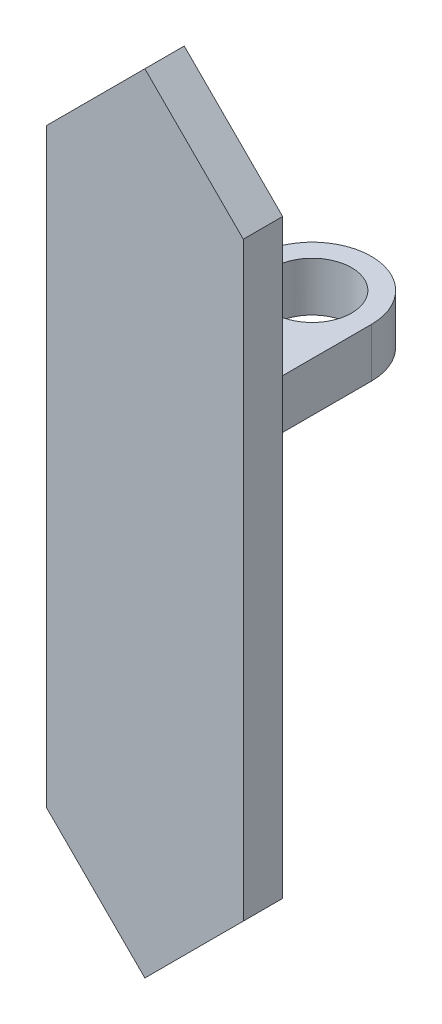
ISO-10303-21;
HEADER;
FILE_DESCRIPTION(('STEP AP214'),'2;1');
FILE_NAME('part.step','',(''),(''),'','','');
FILE_SCHEMA(('AUTOMOTIVE_DESIGN { 1 0 10303 214 1 1 1 1 }'));
ENDSEC;
DATA;
#1=APPLICATION_CONTEXT('core data for automotive mechanical design processes');
#2=APPLICATION_PROTOCOL_DEFINITION('international standard','automotive_design',2000,#1);
#3=PRODUCT_CONTEXT('',#1,'mechanical');
#4=PRODUCT('Part','Part','',(#3));
#5=PRODUCT_RELATED_PRODUCT_CATEGORY('part','',(#4));
#6=PRODUCT_DEFINITION_FORMATION('','',#4);
#7=PRODUCT_DEFINITION_CONTEXT('part definition',#1,'design');
#8=PRODUCT_DEFINITION('design','',#6,#7);
#9=PRODUCT_DEFINITION_SHAPE('','',#8);
#10=(LENGTH_UNIT() NAMED_UNIT(*) SI_UNIT(.MILLI.,.METRE.));
#11=(NAMED_UNIT(*) PLANE_ANGLE_UNIT() SI_UNIT($,.RADIAN.));
#12=(NAMED_UNIT(*) SI_UNIT($,.STERADIAN.) SOLID_ANGLE_UNIT());
#13=UNCERTAINTY_MEASURE_WITH_UNIT(LENGTH_MEASURE(1.E-05),#10,'distance_accuracy_value','');
#14=(GEOMETRIC_REPRESENTATION_CONTEXT(3) GLOBAL_UNCERTAINTY_ASSIGNED_CONTEXT((#13)) GLOBAL_UNIT_ASSIGNED_CONTEXT((#10,
#11,#12)) REPRESENTATION_CONTEXT('',''));
#15=CARTESIAN_POINT('',(0.,0.,0.));
#16=DIRECTION('',(0.,0.,1.));
#17=DIRECTION('',(1.,0.,0.));
#18=AXIS2_PLACEMENT_3D('',#15,#16,#17);
#19=CARTESIAN_POINT('',(4.14728128531616,0.,-20.));
#20=DIRECTION('',(-1.,0.,0.));
#21=DIRECTION('',(0.,0.,1.));
#22=AXIS2_PLACEMENT_3D('',#19,#20,#21);
#23=PLANE('',#22);
#24=DIRECTION('',(0.,0.,1.));
#25=VECTOR('',#24,1.);
#26=CARTESIAN_POINT('',(4.14728128531616,52.,-20.));
#27=LINE('',#26,#25);
#28=CARTESIAN_POINT('',(4.14728128531616,52.,-13.));
#29=VERTEX_POINT('',#28);
#30=CARTESIAN_POINT('',(4.14728128531616,52.,0.));
#31=VERTEX_POINT('',#30);
#32=EDGE_CURVE('E116',#29,#31,#27,.T.);
#33=ORIENTED_EDGE('',*,*,#32,.F.);
#34=DIRECTION('',(0.,-1.,0.));
#35=VECTOR('',#34,1.);
#36=CARTESIAN_POINT('',(4.14728128531616,68.,-13.));
#37=LINE('',#36,#35);
#38=CARTESIAN_POINT('',(4.14728128531616,47.,-13.));
#39=VERTEX_POINT('',#38);
#40=EDGE_CURVE('E171',#29,#39,#37,.T.);
#41=ORIENTED_EDGE('',*,*,#40,.T.);
#42=DIRECTION('',(0.,0.,1.));
#43=VECTOR('',#42,1.);
#44=CARTESIAN_POINT('',(4.14728128531616,47.,-20.));
#45=LINE('',#44,#43);
#46=CARTESIAN_POINT('',(4.14728128531616,47.,0.));
#47=VERTEX_POINT('',#46);
#48=EDGE_CURVE('E179',#39,#47,#45,.T.);
#49=ORIENTED_EDGE('',*,*,#48,.T.);
#50=DIRECTION('',(0.,-1.,0.));
#51=VECTOR('',#50,1.);
#52=CARTESIAN_POINT('',(4.14728128531616,0.,0.));
#53=LINE('',#52,#51);
#54=EDGE_CURVE('E404',#31,#47,#53,.T.);
#55=ORIENTED_EDGE('',*,*,#54,.F.);
#56=EDGE_LOOP('',(#33,#41,#49,#55));
#57=FACE_BOUND('',#56,.T.);
#58=ADVANCED_FACE('F92',(#57),#23,.T.);
#59=CARTESIAN_POINT('',(0.,52.,-20.));
#60=DIRECTION('',(0.,1.,0.));
#61=DIRECTION('',(0.,0.,1.));
#62=AXIS2_PLACEMENT_3D('',#59,#60,#61);
#63=PLANE('',#62);
#64=CARTESIAN_POINT('',(10.1472812853162,52.,-13.));
#65=DIRECTION('',(0.,1.,0.));
#66=DIRECTION('',(0.,0.,1.));
#67=AXIS2_PLACEMENT_3D('',#64,#65,#66);
#68=CIRCLE('',#67,4.);
#69=CARTESIAN_POINT('',(10.1472812853162,52.,-9.));
#70=VERTEX_POINT('',#69);
#71=EDGE_CURVE('E390',#70,#70,#68,.T.);
#72=ORIENTED_EDGE('',*,*,#71,.F.);
#73=EDGE_LOOP('',(#72));
#74=FACE_BOUND('',#73,.T.);
#75=DIRECTION('',(0.,0.,1.));
#76=VECTOR('',#75,1.);
#77=CARTESIAN_POINT('',(16.1472812853162,52.,-20.));
#78=LINE('',#77,#76);
#79=CARTESIAN_POINT('',(16.1472812853162,52.,-13.));
#80=VERTEX_POINT('',#79);
#81=CARTESIAN_POINT('',(16.1472812853162,52.,0.));
#82=VERTEX_POINT('',#81);
#83=EDGE_CURVE('E192',#80,#82,#78,.T.);
#84=ORIENTED_EDGE('',*,*,#83,.F.);
#85=CARTESIAN_POINT('',(10.1472812853162,52.,-13.));
#86=DIRECTION('',(0.,1.,0.));
#87=DIRECTION('',(0.,0.,1.));
#88=AXIS2_PLACEMENT_3D('',#85,#86,#87);
#89=CIRCLE('',#88,6.);
#90=EDGE_CURVE('E398',#80,#29,#89,.T.);
#91=ORIENTED_EDGE('',*,*,#90,.T.);
#92=ORIENTED_EDGE('',*,*,#32,.T.);
#93=DIRECTION('',(-1.,0.,0.));
#94=VECTOR('',#93,1.);
#95=CARTESIAN_POINT('',(0.,52.,0.));
#96=LINE('',#95,#94);
#97=EDGE_CURVE('E407',#82,#31,#96,.T.);
#98=ORIENTED_EDGE('',*,*,#97,.F.);
#99=EDGE_LOOP('',(#84,#91,#92,#98));
#100=FACE_BOUND('',#99,.T.);
#101=ADVANCED_FACE('F304',(#74,#100),#63,.T.);
#102=CARTESIAN_POINT('',(16.1472812853162,0.,-20.));
#103=DIRECTION('',(-1.,0.,0.));
#104=DIRECTION('',(0.,0.,1.));
#105=AXIS2_PLACEMENT_3D('',#102,#103,#104);
#106=PLANE('',#105);
#107=DIRECTION('',(0.,-1.,0.));
#108=VECTOR('',#107,1.);
#109=CARTESIAN_POINT('',(16.1472812853162,68.,-13.));
#110=LINE('',#109,#108);
#111=CARTESIAN_POINT('',(16.1472812853162,47.,-13.));
#112=VERTEX_POINT('',#111);
#113=EDGE_CURVE('E108',#80,#112,#110,.T.);
#114=ORIENTED_EDGE('',*,*,#113,.F.);
#115=ORIENTED_EDGE('',*,*,#83,.T.);
#116=DIRECTION('',(0.,-1.,0.));
#117=VECTOR('',#116,1.);
#118=CARTESIAN_POINT('',(16.1472812853162,0.,0.));
#119=LINE('',#118,#117);
#120=CARTESIAN_POINT('',(16.1472812853162,47.,0.));
#121=VERTEX_POINT('',#120);
#122=EDGE_CURVE('E194',#82,#121,#119,.T.);
#123=ORIENTED_EDGE('',*,*,#122,.T.);
#124=DIRECTION('',(0.,0.,1.));
#125=VECTOR('',#124,1.);
#126=CARTESIAN_POINT('',(16.1472812853162,47.,-20.));
#127=LINE('',#126,#125);
#128=EDGE_CURVE('E188',#112,#121,#127,.T.);
#129=ORIENTED_EDGE('',*,*,#128,.F.);
#130=EDGE_LOOP('',(#114,#115,#123,#129));
#131=FACE_BOUND('',#130,.T.);
#132=ADVANCED_FACE('F297',(#131),#106,.F.);
#133=CARTESIAN_POINT('',(0.,47.,-20.));
#134=DIRECTION('',(0.,1.,0.));
#135=DIRECTION('',(0.,0.,1.));
#136=AXIS2_PLACEMENT_3D('',#133,#134,#135);
#137=PLANE('',#136);
#138=CARTESIAN_POINT('',(10.1472812853162,47.,-13.));
#139=DIRECTION('',(0.,-1.,0.));
#140=DIRECTION('',(0.,0.,-1.));
#141=AXIS2_PLACEMENT_3D('',#138,#139,#140);
#142=CIRCLE('',#141,4.);
#143=CARTESIAN_POINT('',(10.1472812853162,47.,-17.));
#144=VERTEX_POINT('',#143);
#145=EDGE_CURVE('E393',#144,#144,#142,.T.);
#146=ORIENTED_EDGE('',*,*,#145,.F.);
#147=EDGE_LOOP('',(#146));
#148=FACE_BOUND('',#147,.T.);
#149=CARTESIAN_POINT('',(10.1472812853162,47.,-13.));
#150=DIRECTION('',(0.,-1.,0.));
#151=DIRECTION('',(0.,0.,-1.));
#152=AXIS2_PLACEMENT_3D('',#149,#150,#151);
#153=CIRCLE('',#152,6.);
#154=EDGE_CURVE('E168',#39,#112,#153,.T.);
#155=ORIENTED_EDGE('',*,*,#154,.T.);
#156=ORIENTED_EDGE('',*,*,#128,.T.);
#157=DIRECTION('',(-1.,0.,0.));
#158=VECTOR('',#157,1.);
#159=CARTESIAN_POINT('',(0.,47.,0.));
#160=LINE('',#159,#158);
#161=EDGE_CURVE('E186',#121,#47,#160,.T.);
#162=ORIENTED_EDGE('',*,*,#161,.T.);
#163=ORIENTED_EDGE('',*,*,#48,.F.);
#164=EDGE_LOOP('',(#155,#156,#162,#163));
#165=FACE_BOUND('',#164,.T.);
#166=ADVANCED_FACE('F184',(#148,#165),#137,.F.);
#167=CARTESIAN_POINT('',(45.0736406426581,45.0736406426581,4.));
#168=DIRECTION('',(0.707106781186548,0.707106781186547,0.));
#169=DIRECTION('',(-0.707106781186547,0.707106781186548,0.));
#170=AXIS2_PLACEMENT_3D('',#167,#168,#169);
#171=PLANE('',#170);
#172=DIRECTION('',(0.707106781186547,-0.707106781186548,0.));
#173=VECTOR('',#172,1.);
#174=CARTESIAN_POINT('',(45.0736406426581,45.0736406426581,0.));
#175=LINE('',#174,#173);
#176=CARTESIAN_POINT('',(10.1472812853162,80.,0.));
#177=VERTEX_POINT('',#176);
#178=CARTESIAN_POINT('',(20.1472812853162,70.,0.));
#179=VERTEX_POINT('',#178);
#180=EDGE_CURVE('E239',#177,#179,#175,.T.);
#181=ORIENTED_EDGE('',*,*,#180,.F.);
#182=DIRECTION('',(0.,0.,-1.));
#183=VECTOR('',#182,1.);
#184=CARTESIAN_POINT('',(10.1472812853162,80.,4.));
#185=LINE('',#184,#183);
#186=CARTESIAN_POINT('',(10.1472812853162,80.,4.));
#187=VERTEX_POINT('',#186);
#188=EDGE_CURVE('E248',#187,#177,#185,.T.);
#189=ORIENTED_EDGE('',*,*,#188,.F.);
#190=DIRECTION('',(0.707106781186547,-0.707106781186548,0.));
#191=VECTOR('',#190,1.);
#192=CARTESIAN_POINT('',(45.0736406426581,45.0736406426581,4.));
#193=LINE('',#192,#191);
#194=CARTESIAN_POINT('',(20.1472812853162,70.,4.));
#195=VERTEX_POINT('',#194);
#196=EDGE_CURVE('E217',#187,#195,#193,.T.);
#197=ORIENTED_EDGE('',*,*,#196,.T.);
#198=DIRECTION('',(0.,0.,-1.));
#199=VECTOR('',#198,1.);
#200=CARTESIAN_POINT('',(20.1472812853162,70.,4.));
#201=LINE('',#200,#199);
#202=EDGE_CURVE('E251',#195,#179,#201,.T.);
#203=ORIENTED_EDGE('',*,*,#202,.T.);
#204=EDGE_LOOP('',(#181,#189,#197,#203));
#205=FACE_BOUND('',#204,.T.);
#206=ADVANCED_FACE('F288',(#205),#171,.T.);
#207=CARTESIAN_POINT('',(0.,0.,0.));
#208=DIRECTION('',(0.,0.,1.));
#209=DIRECTION('',(1.,0.,0.));
#210=AXIS2_PLACEMENT_3D('',#207,#208,#209);
#211=PLANE('',#210);
#212=ORIENTED_EDGE('',*,*,#97,.T.);
#213=ORIENTED_EDGE('',*,*,#54,.T.);
#214=ORIENTED_EDGE('',*,*,#161,.F.);
#215=ORIENTED_EDGE('',*,*,#122,.F.);
#216=EDGE_LOOP('',(#212,#213,#214,#215));
#217=FACE_BOUND('',#216,.T.);
#218=DIRECTION('',(0.,1.,0.));
#219=VECTOR('',#218,1.);
#220=CARTESIAN_POINT('',(0.147281285316174,0.,0.));
#221=LINE('',#220,#219);
#222=CARTESIAN_POINT('',(0.147281285316174,9.99999999999999,0.));
#223=VERTEX_POINT('',#222);
#224=CARTESIAN_POINT('',(0.147281285316174,70.,0.));
#225=VERTEX_POINT('',#224);
#226=EDGE_CURVE('E202',#223,#225,#221,.T.);
#227=ORIENTED_EDGE('',*,*,#226,.T.);
#228=DIRECTION('',(0.707106781186548,0.707106781186548,0.));
#229=VECTOR('',#228,1.);
#230=CARTESIAN_POINT('',(-34.9263593573419,34.9263593573419,0.));
#231=LINE('',#230,#229);
#232=EDGE_CURVE('E208',#225,#177,#231,.T.);
#233=ORIENTED_EDGE('',*,*,#232,.T.);
#234=ORIENTED_EDGE('',*,*,#180,.T.);
#235=DIRECTION('',(0.,1.,0.));
#236=VECTOR('',#235,1.);
#237=CARTESIAN_POINT('',(20.1472812853162,0.,0.));
#238=LINE('',#237,#236);
#239=CARTESIAN_POINT('',(20.1472812853162,10.,0.));
#240=VERTEX_POINT('',#239);
#241=EDGE_CURVE('E235',#240,#179,#238,.T.);
#242=ORIENTED_EDGE('',*,*,#241,.F.);
#243=DIRECTION('',(0.707106781186548,0.707106781186548,0.));
#244=VECTOR('',#243,1.);
#245=CARTESIAN_POINT('',(5.07364064265808,-5.07364064265808,0.));
#246=LINE('',#245,#244);
#247=CARTESIAN_POINT('',(10.1472812853162,0.,0.));
#248=VERTEX_POINT('',#247);
#249=EDGE_CURVE('E232',#248,#240,#246,.T.);
#250=ORIENTED_EDGE('',*,*,#249,.F.);
#251=DIRECTION('',(0.707106781186548,-0.707106781186548,0.));
#252=VECTOR('',#251,1.);
#253=CARTESIAN_POINT('',(5.07364064265808,5.07364064265808,0.));
#254=LINE('',#253,#252);
#255=EDGE_CURVE('E229',#223,#248,#254,.T.);
#256=ORIENTED_EDGE('',*,*,#255,.F.);
#257=EDGE_LOOP('',(#227,#233,#234,#242,#250,#256));
#258=FACE_BOUND('',#257,.T.);
#259=ADVANCED_FACE('F270',(#217,#258),#211,.F.);
#260=CARTESIAN_POINT('',(20.1472812853162,0.,4.));
#261=DIRECTION('',(-1.,0.,0.));
#262=DIRECTION('',(0.,0.,1.));
#263=AXIS2_PLACEMENT_3D('',#260,#261,#262);
#264=PLANE('',#263);
#265=ORIENTED_EDGE('',*,*,#241,.T.);
#266=ORIENTED_EDGE('',*,*,#202,.F.);
#267=DIRECTION('',(0.,1.,0.));
#268=VECTOR('',#267,1.);
#269=CARTESIAN_POINT('',(20.1472812853162,0.,4.));
#270=LINE('',#269,#268);
#271=CARTESIAN_POINT('',(20.1472812853162,10.,4.));
#272=VERTEX_POINT('',#271);
#273=EDGE_CURVE('E214',#272,#195,#270,.T.);
#274=ORIENTED_EDGE('',*,*,#273,.F.);
#275=DIRECTION('',(0.,0.,-1.));
#276=VECTOR('',#275,1.);
#277=CARTESIAN_POINT('',(20.1472812853162,10.,4.));
#278=LINE('',#277,#276);
#279=EDGE_CURVE('E254',#272,#240,#278,.T.);
#280=ORIENTED_EDGE('',*,*,#279,.T.);
#281=EDGE_LOOP('',(#265,#266,#274,#280));
#282=FACE_BOUND('',#281,.T.);
#283=ADVANCED_FACE('F275',(#282),#264,.F.);
#284=CARTESIAN_POINT('',(5.07364064265808,-5.07364064265808,4.));
#285=DIRECTION('',(-0.707106781186547,0.707106781186547,0.));
#286=DIRECTION('',(-0.707106781186548,-0.707106781186548,0.));
#287=AXIS2_PLACEMENT_3D('',#284,#285,#286);
#288=PLANE('',#287);
#289=ORIENTED_EDGE('',*,*,#249,.T.);
#290=ORIENTED_EDGE('',*,*,#279,.F.);
#291=DIRECTION('',(0.707106781186548,0.707106781186548,0.));
#292=VECTOR('',#291,1.);
#293=CARTESIAN_POINT('',(5.07364064265808,-5.07364064265808,4.));
#294=LINE('',#293,#292);
#295=CARTESIAN_POINT('',(10.1472812853162,0.,4.));
#296=VERTEX_POINT('',#295);
#297=EDGE_CURVE('E211',#296,#272,#294,.T.);
#298=ORIENTED_EDGE('',*,*,#297,.F.);
#299=DIRECTION('',(0.,0.,-1.));
#300=VECTOR('',#299,1.);
#301=CARTESIAN_POINT('',(10.1472812853162,0.,4.));
#302=LINE('',#301,#300);
#303=EDGE_CURVE('E101',#296,#248,#302,.T.);
#304=ORIENTED_EDGE('',*,*,#303,.T.);
#305=EDGE_LOOP('',(#289,#290,#298,#304));
#306=FACE_BOUND('',#305,.T.);
#307=ADVANCED_FACE('F263',(#306),#288,.F.);
#308=CARTESIAN_POINT('',(5.07364064265808,5.07364064265808,4.));
#309=DIRECTION('',(0.707106781186547,0.707106781186547,0.));
#310=DIRECTION('',(-0.707106781186548,0.707106781186548,0.));
#311=AXIS2_PLACEMENT_3D('',#308,#309,#310);
#312=PLANE('',#311);
#313=ORIENTED_EDGE('',*,*,#255,.T.);
#314=ORIENTED_EDGE('',*,*,#303,.F.);
#315=DIRECTION('',(0.707106781186548,-0.707106781186548,0.));
#316=VECTOR('',#315,1.);
#317=CARTESIAN_POINT('',(5.07364064265808,5.07364064265808,4.));
#318=LINE('',#317,#316);
#319=CARTESIAN_POINT('',(0.147281285316174,9.99999999999999,4.));
#320=VERTEX_POINT('',#319);
#321=EDGE_CURVE('E207',#320,#296,#318,.T.);
#322=ORIENTED_EDGE('',*,*,#321,.F.);
#323=DIRECTION('',(0.,0.,-1.));
#324=VECTOR('',#323,1.);
#325=CARTESIAN_POINT('',(0.147281285316174,9.99999999999999,4.));
#326=LINE('',#325,#324);
#327=EDGE_CURVE('E12',#320,#223,#326,.T.);
#328=ORIENTED_EDGE('',*,*,#327,.T.);
#329=EDGE_LOOP('',(#313,#314,#322,#328));
#330=FACE_BOUND('',#329,.T.);
#331=ADVANCED_FACE('F282',(#330),#312,.F.);
#332=CARTESIAN_POINT('',(0.147281285316174,0.,4.));
#333=DIRECTION('',(-1.,0.,0.));
#334=DIRECTION('',(0.,0.,1.));
#335=AXIS2_PLACEMENT_3D('',#332,#333,#334);
#336=PLANE('',#335);
#337=ORIENTED_EDGE('',*,*,#226,.F.);
#338=ORIENTED_EDGE('',*,*,#327,.F.);
#339=DIRECTION('',(0.,1.,0.));
#340=VECTOR('',#339,1.);
#341=CARTESIAN_POINT('',(0.147281285316174,0.,4.));
#342=LINE('',#341,#340);
#343=CARTESIAN_POINT('',(0.147281285316174,70.,4.));
#344=VERTEX_POINT('',#343);
#345=EDGE_CURVE('E203',#320,#344,#342,.T.);
#346=ORIENTED_EDGE('',*,*,#345,.T.);
#347=DIRECTION('',(0.,0.,-1.));
#348=VECTOR('',#347,1.);
#349=CARTESIAN_POINT('',(0.147281285316174,70.,4.));
#350=LINE('',#349,#348);
#351=EDGE_CURVE('E225',#344,#225,#350,.T.);
#352=ORIENTED_EDGE('',*,*,#351,.T.);
#353=EDGE_LOOP('',(#337,#338,#346,#352));
#354=FACE_BOUND('',#353,.T.);
#355=ADVANCED_FACE('F94',(#354),#336,.T.);
#356=CARTESIAN_POINT('',(-34.9263593573419,34.9263593573419,4.));
#357=DIRECTION('',(-0.707106781186547,0.707106781186547,0.));
#358=DIRECTION('',(-0.707106781186548,-0.707106781186548,0.));
#359=AXIS2_PLACEMENT_3D('',#356,#357,#358);
#360=PLANE('',#359);
#361=ORIENTED_EDGE('',*,*,#232,.F.);
#362=ORIENTED_EDGE('',*,*,#351,.F.);
#363=DIRECTION('',(0.707106781186548,0.707106781186548,0.));
#364=VECTOR('',#363,1.);
#365=CARTESIAN_POINT('',(-34.9263593573419,34.9263593573419,4.));
#366=LINE('',#365,#364);
#367=EDGE_CURVE('E221',#344,#187,#366,.T.);
#368=ORIENTED_EDGE('',*,*,#367,.T.);
#369=ORIENTED_EDGE('',*,*,#188,.T.);
#370=EDGE_LOOP('',(#361,#362,#368,#369));
#371=FACE_BOUND('',#370,.T.);
#372=ADVANCED_FACE('F286',(#371),#360,.T.);
#373=CARTESIAN_POINT('',(0.,0.,4.));
#374=DIRECTION('',(0.,0.,1.));
#375=DIRECTION('',(1.,0.,0.));
#376=AXIS2_PLACEMENT_3D('',#373,#374,#375);
#377=PLANE('',#376);
#378=ORIENTED_EDGE('',*,*,#345,.F.);
#379=ORIENTED_EDGE('',*,*,#321,.T.);
#380=ORIENTED_EDGE('',*,*,#297,.T.);
#381=ORIENTED_EDGE('',*,*,#273,.T.);
#382=ORIENTED_EDGE('',*,*,#196,.F.);
#383=ORIENTED_EDGE('',*,*,#367,.F.);
#384=EDGE_LOOP('',(#378,#379,#380,#381,#382,#383));
#385=FACE_BOUND('',#384,.T.);
#386=ADVANCED_FACE('F280',(#385),#377,.T.);
#387=CARTESIAN_POINT('',(10.1472812853162,68.,-13.));
#388=DIRECTION('',(0.,-1.,0.));
#389=DIRECTION('',(0.,0.,-1.));
#390=AXIS2_PLACEMENT_3D('',#387,#388,#389);
#391=CYLINDRICAL_SURFACE('',#390,4.);
#392=ORIENTED_EDGE('',*,*,#71,.T.);
#393=EDGE_LOOP('',(#392));
#394=FACE_BOUND('',#393,.T.);
#395=ORIENTED_EDGE('',*,*,#145,.T.);
#396=EDGE_LOOP('',(#395));
#397=FACE_BOUND('',#396,.T.);
#398=ADVANCED_FACE('F314',(#394,#397),#391,.F.);
#399=CARTESIAN_POINT('',(10.1472812853162,68.,-13.));
#400=DIRECTION('',(0.,-1.,0.));
#401=DIRECTION('',(0.,0.,-1.));
#402=AXIS2_PLACEMENT_3D('',#399,#400,#401);
#403=CYLINDRICAL_SURFACE('',#402,6.);
#404=ORIENTED_EDGE('',*,*,#113,.T.);
#405=ORIENTED_EDGE('',*,*,#154,.F.);
#406=ORIENTED_EDGE('',*,*,#40,.F.);
#407=ORIENTED_EDGE('',*,*,#90,.F.);
#408=EDGE_LOOP('',(#404,#405,#406,#407));
#409=FACE_BOUND('',#408,.T.);
#410=ADVANCED_FACE('F170',(#409),#403,.T.);
#411=CLOSED_SHELL('',(#58,#101,#132,#166,#206,#259,#283,#307,#331,#355,#372,#386,#398,#410));
#412=MANIFOLD_SOLID_BREP('B2',#411);
#413=ADVANCED_BREP_SHAPE_REPRESENTATION('',(#18,#412),#14);
#414=SHAPE_DEFINITION_REPRESENTATION(#9,#413);
ENDSEC;
END-ISO-10303-21;
